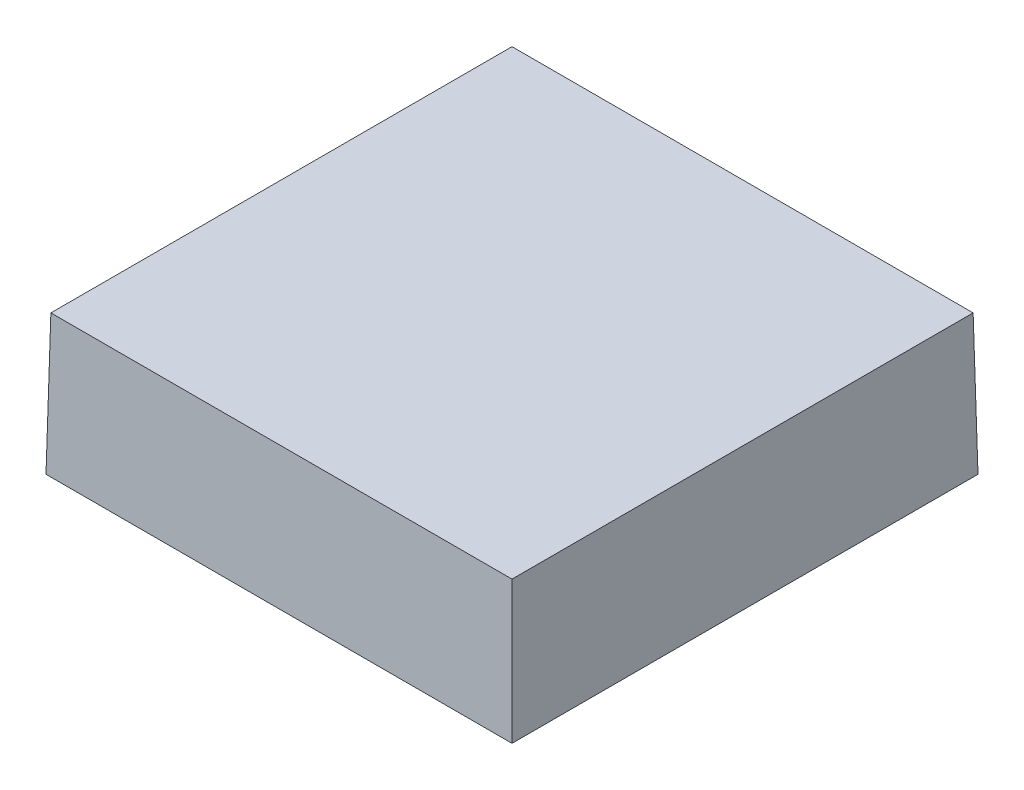
ISO-10303-21;
HEADER;
FILE_DESCRIPTION(('STEP AP214'),'2;1');
FILE_NAME('part.step','',(''),(''),'','','');
FILE_SCHEMA(('AUTOMOTIVE_DESIGN { 1 0 10303 214 1 1 1 1 }'));
ENDSEC;
DATA;
#1=APPLICATION_CONTEXT('core data for automotive mechanical design processes');
#2=APPLICATION_PROTOCOL_DEFINITION('international standard','automotive_design',2000,#1);
#3=PRODUCT_CONTEXT('',#1,'mechanical');
#4=PRODUCT('Part','Part','',(#3));
#5=PRODUCT_RELATED_PRODUCT_CATEGORY('part','',(#4));
#6=PRODUCT_DEFINITION_FORMATION('','',#4);
#7=PRODUCT_DEFINITION_CONTEXT('part definition',#1,'design');
#8=PRODUCT_DEFINITION('design','',#6,#7);
#9=PRODUCT_DEFINITION_SHAPE('','',#8);
#10=(LENGTH_UNIT() NAMED_UNIT(*) SI_UNIT(.MILLI.,.METRE.));
#11=(NAMED_UNIT(*) PLANE_ANGLE_UNIT() SI_UNIT($,.RADIAN.));
#12=(NAMED_UNIT(*) SI_UNIT($,.STERADIAN.) SOLID_ANGLE_UNIT());
#13=UNCERTAINTY_MEASURE_WITH_UNIT(LENGTH_MEASURE(1.E-05),#10,'distance_accuracy_value','');
#14=(GEOMETRIC_REPRESENTATION_CONTEXT(3) GLOBAL_UNCERTAINTY_ASSIGNED_CONTEXT((#13)) GLOBAL_UNIT_ASSIGNED_CONTEXT((#10,
#11,#12)) REPRESENTATION_CONTEXT('',''));
#15=CARTESIAN_POINT('',(0.,0.,0.));
#16=DIRECTION('',(0.,0.,1.));
#17=DIRECTION('',(1.,0.,0.));
#18=AXIS2_PLACEMENT_3D('',#15,#16,#17);
#19=CARTESIAN_POINT('',(-1.,0.3,-1.));
#20=DIRECTION('',(-0.999847695156391,0.0174524064372869,0.));
#21=DIRECTION('',(0.,0.,1.));
#22=AXIS2_PLACEMENT_3D('',#19,#20,#21);
#23=PLANE('',#22);
#24=DIRECTION('',(0.,0.,1.));
#25=VECTOR('',#24,1.);
#26=CARTESIAN_POINT('',(-1.,0.3,1.));
#27=LINE('',#26,#25);
#28=CARTESIAN_POINT('',(-1.,0.3,-1.));
#29=VERTEX_POINT('',#28);
#30=CARTESIAN_POINT('',(-1.,0.3,1.));
#31=VERTEX_POINT('',#30);
#32=EDGE_CURVE('E93',#29,#31,#27,.T.);
#33=ORIENTED_EDGE('',*,*,#32,.T.);
#34=DIRECTION('',(0.0174497491606781,0.999695459881888,-0.0174497491606781));
#35=VECTOR('',#34,1.);
#36=CARTESIAN_POINT('',(-0.999695506254,0.317444435012,0.999695506254));
#37=LINE('',#36,#35);
#38=CARTESIAN_POINT('',(-0.989526961043,0.9,0.989526961043));
#39=VERTEX_POINT('',#38);
#40=EDGE_CURVE('E79',#31,#39,#37,.T.);
#41=ORIENTED_EDGE('',*,*,#40,.T.);
#42=DIRECTION('',(0.,0.,1.));
#43=VECTOR('',#42,1.);
#44=CARTESIAN_POINT('',(-0.989526961043,0.9,-0.5));
#45=LINE('',#44,#43);
#46=CARTESIAN_POINT('',(-0.989526961043,0.9,-0.989526961043));
#47=VERTEX_POINT('',#46);
#48=EDGE_CURVE('E80',#47,#39,#45,.T.);
#49=ORIENTED_EDGE('',*,*,#48,.F.);
#50=DIRECTION('',(0.0174497491606781,0.999695459881888,0.0174497491606781));
#51=VECTOR('',#50,1.);
#52=CARTESIAN_POINT('',(-0.999695506254,0.317444435012,-0.999695506254));
#53=LINE('',#52,#51);
#54=EDGE_CURVE('E11',#29,#47,#53,.T.);
#55=ORIENTED_EDGE('',*,*,#54,.F.);
#56=EDGE_LOOP('',(#33,#41,#49,#55));
#57=FACE_BOUND('',#56,.T.);
#58=ADVANCED_FACE('F17',(#57),#23,.T.);
#59=CARTESIAN_POINT('',(1.,0.3,-1.));
#60=DIRECTION('',(0.,0.0174524064372869,-0.999847695156391));
#61=DIRECTION('',(-1.,0.,0.));
#62=AXIS2_PLACEMENT_3D('',#59,#60,#61);
#63=PLANE('',#62);
#64=DIRECTION('',(-1.,0.,0.));
#65=VECTOR('',#64,1.);
#66=CARTESIAN_POINT('',(-1.,0.3,-1.));
#67=LINE('',#66,#65);
#68=CARTESIAN_POINT('',(1.,0.3,-1.));
#69=VERTEX_POINT('',#68);
#70=EDGE_CURVE('E86',#69,#29,#67,.T.);
#71=ORIENTED_EDGE('',*,*,#70,.T.);
#72=ORIENTED_EDGE('',*,*,#54,.T.);
#73=DIRECTION('',(-1.,0.,0.));
#74=VECTOR('',#73,1.);
#75=CARTESIAN_POINT('',(0.5,0.9,-0.989526961043));
#76=LINE('',#75,#74);
#77=CARTESIAN_POINT('',(0.989526961043,0.9,-0.989526961043));
#78=VERTEX_POINT('',#77);
#79=EDGE_CURVE('E104',#78,#47,#76,.T.);
#80=ORIENTED_EDGE('',*,*,#79,.F.);
#81=DIRECTION('',(-0.0174497491606781,0.999695459881888,0.0174497491606781));
#82=VECTOR('',#81,1.);
#83=CARTESIAN_POINT('',(0.999695506254,0.317444435012,-0.999695506254));
#84=LINE('',#83,#82);
#85=EDGE_CURVE('E21',#69,#78,#84,.T.);
#86=ORIENTED_EDGE('',*,*,#85,.F.);
#87=EDGE_LOOP('',(#71,#72,#80,#86));
#88=FACE_BOUND('',#87,.T.);
#89=ADVANCED_FACE('F120',(#88),#63,.T.);
#90=CARTESIAN_POINT('',(1.,0.3,1.));
#91=DIRECTION('',(0.999847695156391,0.0174524064372869,0.));
#92=DIRECTION('',(0.,0.,-1.));
#93=AXIS2_PLACEMENT_3D('',#90,#91,#92);
#94=PLANE('',#93);
#95=DIRECTION('',(0.,0.,-1.));
#96=VECTOR('',#95,1.);
#97=CARTESIAN_POINT('',(1.,0.3,-1.));
#98=LINE('',#97,#96);
#99=CARTESIAN_POINT('',(1.,0.3,1.));
#100=VERTEX_POINT('',#99);
#101=EDGE_CURVE('E70',#100,#69,#98,.T.);
#102=ORIENTED_EDGE('',*,*,#101,.T.);
#103=ORIENTED_EDGE('',*,*,#85,.T.);
#104=DIRECTION('',(0.,0.,-1.));
#105=VECTOR('',#104,1.);
#106=CARTESIAN_POINT('',(0.989526961043,0.9,0.5));
#107=LINE('',#106,#105);
#108=CARTESIAN_POINT('',(0.989526961043,0.9,0.989526961043));
#109=VERTEX_POINT('',#108);
#110=EDGE_CURVE('E73',#109,#78,#107,.T.);
#111=ORIENTED_EDGE('',*,*,#110,.F.);
#112=DIRECTION('',(-0.0174497491606781,0.999695459881888,-0.0174497491606781));
#113=VECTOR('',#112,1.);
#114=CARTESIAN_POINT('',(0.999695506254,0.317444435012,0.999695506254));
#115=LINE('',#114,#113);
#116=EDGE_CURVE('E67',#100,#109,#115,.T.);
#117=ORIENTED_EDGE('',*,*,#116,.F.);
#118=EDGE_LOOP('',(#102,#103,#111,#117));
#119=FACE_BOUND('',#118,.T.);
#120=ADVANCED_FACE('F69',(#119),#94,.T.);
#121=CARTESIAN_POINT('',(-1.,0.3,1.));
#122=DIRECTION('',(0.,0.0174524064372869,0.999847695156391));
#123=DIRECTION('',(1.,0.,0.));
#124=AXIS2_PLACEMENT_3D('',#121,#122,#123);
#125=PLANE('',#124);
#126=DIRECTION('',(1.,0.,0.));
#127=VECTOR('',#126,1.);
#128=CARTESIAN_POINT('',(1.,0.3,1.));
#129=LINE('',#128,#127);
#130=EDGE_CURVE('E85',#31,#100,#129,.T.);
#131=ORIENTED_EDGE('',*,*,#130,.T.);
#132=ORIENTED_EDGE('',*,*,#116,.T.);
#133=DIRECTION('',(1.,0.,0.));
#134=VECTOR('',#133,1.);
#135=CARTESIAN_POINT('',(-0.5,0.9,0.989526961043));
#136=LINE('',#135,#134);
#137=EDGE_CURVE('E88',#39,#109,#136,.T.);
#138=ORIENTED_EDGE('',*,*,#137,.F.);
#139=ORIENTED_EDGE('',*,*,#40,.F.);
#140=EDGE_LOOP('',(#131,#132,#138,#139));
#141=FACE_BOUND('',#140,.T.);
#142=ADVANCED_FACE('F90',(#141),#125,.T.);
#143=CARTESIAN_POINT('',(0.,0.9,0.));
#144=DIRECTION('',(0.,1.,0.));
#145=DIRECTION('',(1.,0.,0.));
#146=AXIS2_PLACEMENT_3D('',#143,#144,#145);
#147=PLANE('',#146);
#148=ORIENTED_EDGE('',*,*,#137,.T.);
#149=ORIENTED_EDGE('',*,*,#110,.T.);
#150=ORIENTED_EDGE('',*,*,#79,.T.);
#151=ORIENTED_EDGE('',*,*,#48,.T.);
#152=EDGE_LOOP('',(#148,#149,#150,#151));
#153=FACE_BOUND('',#152,.T.);
#154=ADVANCED_FACE('F122',(#153),#147,.T.);
#155=CARTESIAN_POINT('',(0.,0.3,0.));
#156=DIRECTION('',(0.,1.,0.));
#157=DIRECTION('',(1.,0.,0.));
#158=AXIS2_PLACEMENT_3D('',#155,#156,#157);
#159=PLANE('',#158);
#160=ORIENTED_EDGE('',*,*,#130,.F.);
#161=ORIENTED_EDGE('',*,*,#32,.F.);
#162=ORIENTED_EDGE('',*,*,#70,.F.);
#163=ORIENTED_EDGE('',*,*,#101,.F.);
#164=EDGE_LOOP('',(#160,#161,#162,#163));
#165=FACE_BOUND('',#164,.T.);
#166=ADVANCED_FACE('F19',(#165),#159,.F.);
#167=CLOSED_SHELL('',(#58,#89,#120,#142,#154,#166));
#168=MANIFOLD_SOLID_BREP('B1',#167);
#169=ADVANCED_BREP_SHAPE_REPRESENTATION('',(#18,#168),#14);
#170=SHAPE_DEFINITION_REPRESENTATION(#9,#169);
ENDSEC;
END-ISO-10303-21;
